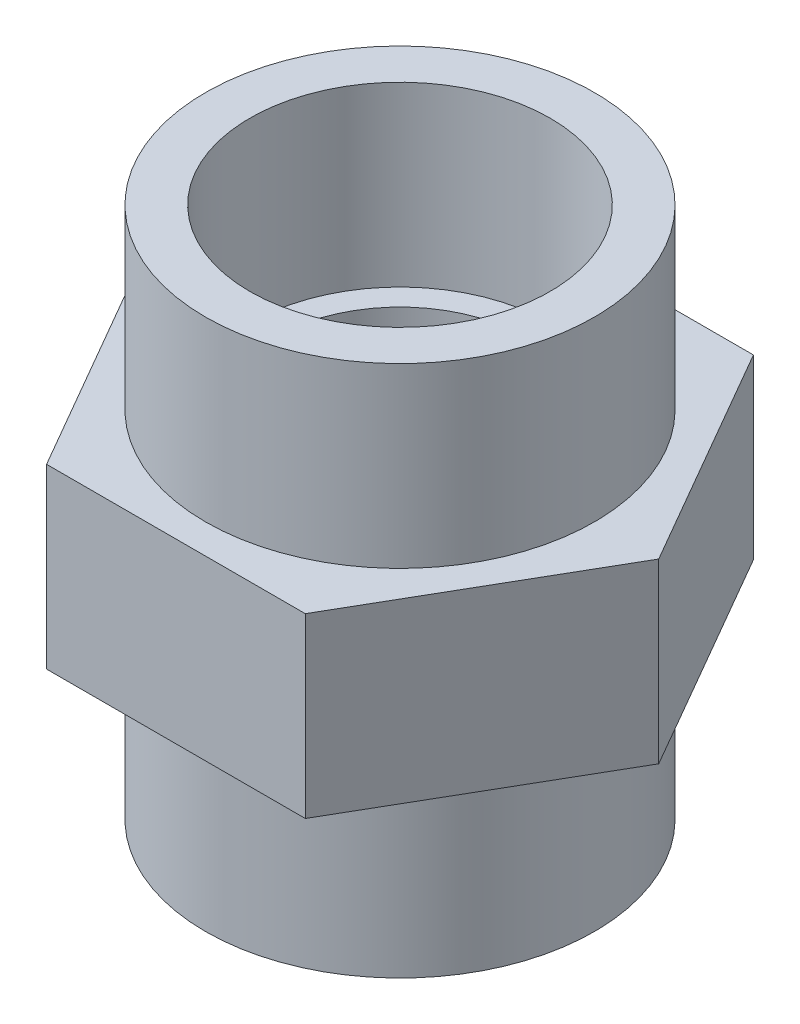
ISO-10303-21;
HEADER;
FILE_DESCRIPTION(('STEP AP214'),'2;1');
FILE_NAME('part.step','',(''),(''),'','','');
FILE_SCHEMA(('AUTOMOTIVE_DESIGN { 1 0 10303 214 1 1 1 1 }'));
ENDSEC;
DATA;
#1=APPLICATION_CONTEXT('core data for automotive mechanical design processes');
#2=APPLICATION_PROTOCOL_DEFINITION('international standard','automotive_design',2000,#1);
#3=PRODUCT_CONTEXT('',#1,'mechanical');
#4=PRODUCT('Part','Part','',(#3));
#5=PRODUCT_RELATED_PRODUCT_CATEGORY('part','',(#4));
#6=PRODUCT_DEFINITION_FORMATION('','',#4);
#7=PRODUCT_DEFINITION_CONTEXT('part definition',#1,'design');
#8=PRODUCT_DEFINITION('design','',#6,#7);
#9=PRODUCT_DEFINITION_SHAPE('','',#8);
#10=(LENGTH_UNIT() NAMED_UNIT(*) SI_UNIT(.MILLI.,.METRE.));
#11=(NAMED_UNIT(*) PLANE_ANGLE_UNIT() SI_UNIT($,.RADIAN.));
#12=(NAMED_UNIT(*) SI_UNIT($,.STERADIAN.) SOLID_ANGLE_UNIT());
#13=UNCERTAINTY_MEASURE_WITH_UNIT(LENGTH_MEASURE(1.E-05),#10,'distance_accuracy_value','');
#14=(GEOMETRIC_REPRESENTATION_CONTEXT(3) GLOBAL_UNCERTAINTY_ASSIGNED_CONTEXT((#13)) GLOBAL_UNIT_ASSIGNED_CONTEXT((#10,
#11,#12)) REPRESENTATION_CONTEXT('',''));
#15=CARTESIAN_POINT('',(0.,0.,0.));
#16=DIRECTION('',(0.,0.,1.));
#17=DIRECTION('',(1.,0.,0.));
#18=AXIS2_PLACEMENT_3D('',#15,#16,#17);
#19=CARTESIAN_POINT('',(0.,6.,0.));
#20=DIRECTION('',(0.,1.,0.));
#21=DIRECTION('',(0.,0.,1.));
#22=AXIS2_PLACEMENT_3D('',#19,#20,#21);
#23=PLANE('',#22);
#24=CARTESIAN_POINT('',(0.,6.,0.));
#25=DIRECTION('',(0.,1.,0.));
#26=DIRECTION('',(0.,0.,1.));
#27=AXIS2_PLACEMENT_3D('',#24,#25,#26);
#28=CIRCLE('',#27,4.25);
#29=CARTESIAN_POINT('',(0.,6.,4.25));
#30=VERTEX_POINT('',#29);
#31=EDGE_CURVE('E148',#30,#30,#28,.T.);
#32=ORIENTED_EDGE('',*,*,#31,.F.);
#33=EDGE_LOOP('',(#32));
#34=FACE_BOUND('',#33,.T.);
#35=CARTESIAN_POINT('',(0.,6.,0.));
#36=DIRECTION('',(0.,1.,0.));
#37=DIRECTION('',(0.,0.,1.));
#38=AXIS2_PLACEMENT_3D('',#35,#36,#37);
#39=CIRCLE('',#38,5.079);
#40=CARTESIAN_POINT('',(0.,6.,5.079));
#41=VERTEX_POINT('',#40);
#42=EDGE_CURVE('E12',#41,#41,#39,.F.);
#43=ORIENTED_EDGE('',*,*,#42,.F.);
#44=EDGE_LOOP('',(#43));
#45=FACE_BOUND('',#44,.T.);
#46=ADVANCED_FACE('F58',(#34,#45),#23,.T.);
#47=CARTESIAN_POINT('',(0.,-6.,0.));
#48=DIRECTION('',(0.,1.,0.));
#49=DIRECTION('',(0.,0.,1.));
#50=AXIS2_PLACEMENT_3D('',#47,#48,#49);
#51=CYLINDRICAL_SURFACE('',#50,4.25);
#52=CARTESIAN_POINT('',(0.,-6.,0.));
#53=DIRECTION('',(0.,1.,0.));
#54=DIRECTION('',(0.,0.,1.));
#55=AXIS2_PLACEMENT_3D('',#52,#53,#54);
#56=CIRCLE('',#55,4.25);
#57=CARTESIAN_POINT('',(0.,-6.,4.25));
#58=VERTEX_POINT('',#57);
#59=EDGE_CURVE('E165',#58,#58,#56,.T.);
#60=ORIENTED_EDGE('',*,*,#59,.F.);
#61=EDGE_LOOP('',(#60));
#62=FACE_BOUND('',#61,.T.);
#63=ORIENTED_EDGE('',*,*,#31,.T.);
#64=EDGE_LOOP('',(#63));
#65=FACE_BOUND('',#64,.T.);
#66=ADVANCED_FACE('F60',(#62,#65),#51,.F.);
#67=CARTESIAN_POINT('',(0.,-6.,0.));
#68=DIRECTION('',(0.,1.,0.));
#69=DIRECTION('',(0.,0.,1.));
#70=AXIS2_PLACEMENT_3D('',#67,#68,#69);
#71=CYLINDRICAL_SURFACE('',#70,6.579);
#72=CARTESIAN_POINT('',(0.,-6.,0.));
#73=DIRECTION('',(0.,1.,0.));
#74=DIRECTION('',(0.,0.,1.));
#75=AXIS2_PLACEMENT_3D('',#72,#73,#74);
#76=CIRCLE('',#75,6.579);
#77=CARTESIAN_POINT('',(0.,-6.,6.579));
#78=VERTEX_POINT('',#77);
#79=EDGE_CURVE('E67',#78,#78,#76,.T.);
#80=ORIENTED_EDGE('',*,*,#79,.T.);
#81=EDGE_LOOP('',(#80));
#82=FACE_BOUND('',#81,.T.);
#83=CARTESIAN_POINT('',(0.,0.,0.));
#84=DIRECTION('',(0.,1.,0.));
#85=DIRECTION('',(0.,0.,1.));
#86=AXIS2_PLACEMENT_3D('',#83,#84,#85);
#87=CIRCLE('',#86,6.579);
#88=CARTESIAN_POINT('',(0.,0.,6.579));
#89=VERTEX_POINT('',#88);
#90=EDGE_CURVE('E164',#89,#89,#87,.T.);
#91=ORIENTED_EDGE('',*,*,#90,.F.);
#92=EDGE_LOOP('',(#91));
#93=FACE_BOUND('',#92,.T.);
#94=ADVANCED_FACE('F175',(#82,#93),#71,.T.);
#95=CARTESIAN_POINT('',(0.,-6.,0.));
#96=DIRECTION('',(0.,1.,0.));
#97=DIRECTION('',(0.,0.,1.));
#98=AXIS2_PLACEMENT_3D('',#95,#96,#97);
#99=PLANE('',#98);
#100=ORIENTED_EDGE('',*,*,#59,.T.);
#101=EDGE_LOOP('',(#100));
#102=FACE_BOUND('',#101,.T.);
#103=ORIENTED_EDGE('',*,*,#79,.F.);
#104=EDGE_LOOP('',(#103));
#105=FACE_BOUND('',#104,.T.);
#106=ADVANCED_FACE('F177',(#102,#105),#99,.F.);
#107=CARTESIAN_POINT('',(0.,6.,0.));
#108=DIRECTION('',(0.,1.,0.));
#109=DIRECTION('',(0.,0.,1.));
#110=AXIS2_PLACEMENT_3D('',#107,#108,#109);
#111=CIRCLE('',#110,6.579);
#112=CARTESIAN_POINT('',(0.,6.,6.579));
#113=VERTEX_POINT('',#112);
#114=EDGE_CURVE('E203',#113,#113,#111,.T.);
#115=ORIENTED_EDGE('',*,*,#114,.F.);
#116=EDGE_LOOP('',(#115));
#117=FACE_BOUND('',#116,.T.);
#118=DIRECTION('',(0.5,0.,-0.866025403784439));
#119=VECTOR('',#118,1.);
#120=CARTESIAN_POINT('',(4.37573769018817,6.,7.579));
#121=LINE('',#120,#119);
#122=CARTESIAN_POINT('',(4.37573769018817,6.,7.579));
#123=VERTEX_POINT('',#122);
#124=CARTESIAN_POINT('',(8.75147538037634,6.,0.));
#125=VERTEX_POINT('',#124);
#126=EDGE_CURVE('E155',#123,#125,#121,.T.);
#127=ORIENTED_EDGE('',*,*,#126,.T.);
#128=DIRECTION('',(-0.5,0.,-0.866025403784438));
#129=VECTOR('',#128,1.);
#130=CARTESIAN_POINT('',(8.75147538037634,6.,0.));
#131=LINE('',#130,#129);
#132=CARTESIAN_POINT('',(4.37573769018817,6.,-7.579));
#133=VERTEX_POINT('',#132);
#134=EDGE_CURVE('E113',#125,#133,#131,.T.);
#135=ORIENTED_EDGE('',*,*,#134,.T.);
#136=DIRECTION('',(-1.,0.,0.));
#137=VECTOR('',#136,1.);
#138=CARTESIAN_POINT('',(4.37573769018817,6.,-7.579));
#139=LINE('',#138,#137);
#140=CARTESIAN_POINT('',(-4.37573769018818,6.,-7.579));
#141=VERTEX_POINT('',#140);
#142=EDGE_CURVE('E126',#133,#141,#139,.T.);
#143=ORIENTED_EDGE('',*,*,#142,.T.);
#144=DIRECTION('',(-0.5,0.,0.866025403784439));
#145=VECTOR('',#144,1.);
#146=CARTESIAN_POINT('',(-4.37573769018818,6.,-7.579));
#147=LINE('',#146,#145);
#148=CARTESIAN_POINT('',(-8.75147538037635,6.,0.));
#149=VERTEX_POINT('',#148);
#150=EDGE_CURVE('E120',#141,#149,#147,.T.);
#151=ORIENTED_EDGE('',*,*,#150,.T.);
#152=DIRECTION('',(0.5,0.,0.866025403784439));
#153=VECTOR('',#152,1.);
#154=CARTESIAN_POINT('',(-8.75147538037635,6.,0.));
#155=LINE('',#154,#153);
#156=CARTESIAN_POINT('',(-4.37573769018817,6.,7.579));
#157=VERTEX_POINT('',#156);
#158=EDGE_CURVE('E124',#149,#157,#155,.T.);
#159=ORIENTED_EDGE('',*,*,#158,.T.);
#160=DIRECTION('',(1.,0.,0.));
#161=VECTOR('',#160,1.);
#162=CARTESIAN_POINT('',(-4.37573769018817,6.,7.579));
#163=LINE('',#162,#161);
#164=EDGE_CURVE('E75',#157,#123,#163,.T.);
#165=ORIENTED_EDGE('',*,*,#164,.T.);
#166=EDGE_LOOP('',(#127,#135,#143,#151,#159,#165));
#167=FACE_BOUND('',#166,.T.);
#168=ADVANCED_FACE('F122',(#117,#167),#23,.T.);
#169=CARTESIAN_POINT('',(0.,0.,0.));
#170=DIRECTION('',(0.,1.,0.));
#171=DIRECTION('',(0.,0.,1.));
#172=AXIS2_PLACEMENT_3D('',#169,#170,#171);
#173=PLANE('',#172);
#174=ORIENTED_EDGE('',*,*,#90,.T.);
#175=EDGE_LOOP('',(#174));
#176=FACE_BOUND('',#175,.T.);
#177=DIRECTION('',(0.5,0.,-0.866025403784439));
#178=VECTOR('',#177,1.);
#179=CARTESIAN_POINT('',(4.37573769018817,0.,7.579));
#180=LINE('',#179,#178);
#181=CARTESIAN_POINT('',(4.37573769018817,0.,7.579));
#182=VERTEX_POINT('',#181);
#183=CARTESIAN_POINT('',(8.75147538037634,0.,0.));
#184=VERTEX_POINT('',#183);
#185=EDGE_CURVE('E144',#182,#184,#180,.T.);
#186=ORIENTED_EDGE('',*,*,#185,.F.);
#187=DIRECTION('',(1.,0.,0.));
#188=VECTOR('',#187,1.);
#189=CARTESIAN_POINT('',(-4.37573769018817,0.,7.579));
#190=LINE('',#189,#188);
#191=CARTESIAN_POINT('',(-4.37573769018817,0.,7.579));
#192=VERTEX_POINT('',#191);
#193=EDGE_CURVE('E104',#192,#182,#190,.T.);
#194=ORIENTED_EDGE('',*,*,#193,.F.);
#195=DIRECTION('',(0.5,0.,0.866025403784439));
#196=VECTOR('',#195,1.);
#197=CARTESIAN_POINT('',(-8.75147538037635,0.,0.));
#198=LINE('',#197,#196);
#199=CARTESIAN_POINT('',(-8.75147538037635,0.,0.));
#200=VERTEX_POINT('',#199);
#201=EDGE_CURVE('E98',#200,#192,#198,.T.);
#202=ORIENTED_EDGE('',*,*,#201,.F.);
#203=DIRECTION('',(-0.5,0.,0.866025403784439));
#204=VECTOR('',#203,1.);
#205=CARTESIAN_POINT('',(-4.37573769018818,0.,-7.579));
#206=LINE('',#205,#204);
#207=CARTESIAN_POINT('',(-4.37573769018818,0.,-7.579));
#208=VERTEX_POINT('',#207);
#209=EDGE_CURVE('E134',#208,#200,#206,.T.);
#210=ORIENTED_EDGE('',*,*,#209,.F.);
#211=DIRECTION('',(-1.,0.,0.));
#212=VECTOR('',#211,1.);
#213=CARTESIAN_POINT('',(4.37573769018817,0.,-7.579));
#214=LINE('',#213,#212);
#215=CARTESIAN_POINT('',(4.37573769018817,0.,-7.579));
#216=VERTEX_POINT('',#215);
#217=EDGE_CURVE('E150',#216,#208,#214,.T.);
#218=ORIENTED_EDGE('',*,*,#217,.F.);
#219=DIRECTION('',(-0.5,0.,-0.866025403784438));
#220=VECTOR('',#219,1.);
#221=CARTESIAN_POINT('',(8.75147538037634,0.,0.));
#222=LINE('',#221,#220);
#223=EDGE_CURVE('E147',#184,#216,#222,.T.);
#224=ORIENTED_EDGE('',*,*,#223,.F.);
#225=EDGE_LOOP('',(#186,#194,#202,#210,#218,#224));
#226=FACE_BOUND('',#225,.T.);
#227=ADVANCED_FACE('F172',(#176,#226),#173,.F.);
#228=CARTESIAN_POINT('',(4.37573769018817,6.,7.579));
#229=DIRECTION('',(-0.866025403784439,0.,-0.5));
#230=DIRECTION('',(-0.5,0.,0.866025403784439));
#231=AXIS2_PLACEMENT_3D('',#228,#229,#230);
#232=PLANE('',#231);
#233=ORIENTED_EDGE('',*,*,#185,.T.);
#234=DIRECTION('',(0.,-1.,0.));
#235=VECTOR('',#234,1.);
#236=CARTESIAN_POINT('',(8.75147538037634,6.,0.));
#237=LINE('',#236,#235);
#238=EDGE_CURVE('E162',#125,#184,#237,.T.);
#239=ORIENTED_EDGE('',*,*,#238,.F.);
#240=ORIENTED_EDGE('',*,*,#126,.F.);
#241=DIRECTION('',(0.,-1.,0.));
#242=VECTOR('',#241,1.);
#243=CARTESIAN_POINT('',(4.37573769018817,6.,7.579));
#244=LINE('',#243,#242);
#245=EDGE_CURVE('E140',#123,#182,#244,.T.);
#246=ORIENTED_EDGE('',*,*,#245,.T.);
#247=EDGE_LOOP('',(#233,#239,#240,#246));
#248=FACE_BOUND('',#247,.T.);
#249=ADVANCED_FACE('F200',(#248),#232,.F.);
#250=CARTESIAN_POINT('',(8.75147538037634,6.,0.));
#251=DIRECTION('',(-0.866025403784439,0.,0.5));
#252=DIRECTION('',(0.5,0.,0.866025403784439));
#253=AXIS2_PLACEMENT_3D('',#250,#251,#252);
#254=PLANE('',#253);
#255=ORIENTED_EDGE('',*,*,#223,.T.);
#256=DIRECTION('',(0.,-1.,0.));
#257=VECTOR('',#256,1.);
#258=CARTESIAN_POINT('',(4.37573769018817,6.,-7.579));
#259=LINE('',#258,#257);
#260=EDGE_CURVE('E159',#133,#216,#259,.T.);
#261=ORIENTED_EDGE('',*,*,#260,.F.);
#262=ORIENTED_EDGE('',*,*,#134,.F.);
#263=ORIENTED_EDGE('',*,*,#238,.T.);
#264=EDGE_LOOP('',(#255,#261,#262,#263));
#265=FACE_BOUND('',#264,.T.);
#266=ADVANCED_FACE('F218',(#265),#254,.F.);
#267=CARTESIAN_POINT('',(4.37573769018817,6.,-7.579));
#268=DIRECTION('',(0.,0.,1.));
#269=DIRECTION('',(1.,0.,0.));
#270=AXIS2_PLACEMENT_3D('',#267,#268,#269);
#271=PLANE('',#270);
#272=ORIENTED_EDGE('',*,*,#217,.T.);
#273=DIRECTION('',(0.,-1.,0.));
#274=VECTOR('',#273,1.);
#275=CARTESIAN_POINT('',(-4.37573769018818,6.,-7.579));
#276=LINE('',#275,#274);
#277=EDGE_CURVE('E135',#141,#208,#276,.T.);
#278=ORIENTED_EDGE('',*,*,#277,.F.);
#279=ORIENTED_EDGE('',*,*,#142,.F.);
#280=ORIENTED_EDGE('',*,*,#260,.T.);
#281=EDGE_LOOP('',(#272,#278,#279,#280));
#282=FACE_BOUND('',#281,.T.);
#283=ADVANCED_FACE('F221',(#282),#271,.F.);
#284=CARTESIAN_POINT('',(-4.37573769018818,6.,-7.579));
#285=DIRECTION('',(0.866025403784439,0.,0.5));
#286=DIRECTION('',(0.5,0.,-0.866025403784439));
#287=AXIS2_PLACEMENT_3D('',#284,#285,#286);
#288=PLANE('',#287);
#289=ORIENTED_EDGE('',*,*,#209,.T.);
#290=DIRECTION('',(0.,-1.,0.));
#291=VECTOR('',#290,1.);
#292=CARTESIAN_POINT('',(-8.75147538037635,6.,0.));
#293=LINE('',#292,#291);
#294=EDGE_CURVE('E131',#149,#200,#293,.T.);
#295=ORIENTED_EDGE('',*,*,#294,.F.);
#296=ORIENTED_EDGE('',*,*,#150,.F.);
#297=ORIENTED_EDGE('',*,*,#277,.T.);
#298=EDGE_LOOP('',(#289,#295,#296,#297));
#299=FACE_BOUND('',#298,.T.);
#300=ADVANCED_FACE('F132',(#299),#288,.F.);
#301=CARTESIAN_POINT('',(-8.75147538037635,6.,0.));
#302=DIRECTION('',(0.866025403784438,0.,-0.5));
#303=DIRECTION('',(-0.5,0.,-0.866025403784439));
#304=AXIS2_PLACEMENT_3D('',#301,#302,#303);
#305=PLANE('',#304);
#306=ORIENTED_EDGE('',*,*,#201,.T.);
#307=DIRECTION('',(0.,-1.,0.));
#308=VECTOR('',#307,1.);
#309=CARTESIAN_POINT('',(-4.37573769018817,6.,7.579));
#310=LINE('',#309,#308);
#311=EDGE_CURVE('E136',#157,#192,#310,.T.);
#312=ORIENTED_EDGE('',*,*,#311,.F.);
#313=ORIENTED_EDGE('',*,*,#158,.F.);
#314=ORIENTED_EDGE('',*,*,#294,.T.);
#315=EDGE_LOOP('',(#306,#312,#313,#314));
#316=FACE_BOUND('',#315,.T.);
#317=ADVANCED_FACE('F138',(#316),#305,.F.);
#318=CARTESIAN_POINT('',(-4.37573769018817,6.,7.579));
#319=DIRECTION('',(0.,0.,-1.));
#320=DIRECTION('',(-1.,0.,0.));
#321=AXIS2_PLACEMENT_3D('',#318,#319,#320);
#322=PLANE('',#321);
#323=ORIENTED_EDGE('',*,*,#193,.T.);
#324=ORIENTED_EDGE('',*,*,#245,.F.);
#325=ORIENTED_EDGE('',*,*,#164,.F.);
#326=ORIENTED_EDGE('',*,*,#311,.T.);
#327=EDGE_LOOP('',(#323,#324,#325,#326));
#328=FACE_BOUND('',#327,.T.);
#329=ADVANCED_FACE('F224',(#328),#322,.F.);
#330=CARTESIAN_POINT('',(0.,12.,0.));
#331=DIRECTION('',(0.,1.,0.));
#332=DIRECTION('',(0.,0.,1.));
#333=AXIS2_PLACEMENT_3D('',#330,#331,#332);
#334=PLANE('',#333);
#335=CARTESIAN_POINT('',(0.,12.,0.));
#336=DIRECTION('',(0.,1.,0.));
#337=DIRECTION('',(0.,0.,1.));
#338=AXIS2_PLACEMENT_3D('',#335,#336,#337);
#339=CIRCLE('',#338,6.579);
#340=CARTESIAN_POINT('',(0.,12.,6.579));
#341=VERTEX_POINT('',#340);
#342=EDGE_CURVE('E205',#341,#341,#339,.T.);
#343=ORIENTED_EDGE('',*,*,#342,.T.);
#344=EDGE_LOOP('',(#343));
#345=FACE_BOUND('',#344,.T.);
#346=CARTESIAN_POINT('',(0.,12.,0.));
#347=DIRECTION('',(0.,1.,0.));
#348=DIRECTION('',(0.,0.,1.));
#349=AXIS2_PLACEMENT_3D('',#346,#347,#348);
#350=CIRCLE('',#349,5.079);
#351=CARTESIAN_POINT('',(0.,12.,5.079));
#352=VERTEX_POINT('',#351);
#353=EDGE_CURVE('E206',#352,#352,#350,.T.);
#354=ORIENTED_EDGE('',*,*,#353,.F.);
#355=EDGE_LOOP('',(#354));
#356=FACE_BOUND('',#355,.T.);
#357=ADVANCED_FACE('F226',(#345,#356),#334,.T.);
#358=CARTESIAN_POINT('',(0.,12.,0.));
#359=DIRECTION('',(0.,-1.,0.));
#360=DIRECTION('',(0.,0.,-1.));
#361=AXIS2_PLACEMENT_3D('',#358,#359,#360);
#362=CYLINDRICAL_SURFACE('',#361,6.579);
#363=ORIENTED_EDGE('',*,*,#342,.F.);
#364=EDGE_LOOP('',(#363));
#365=FACE_BOUND('',#364,.T.);
#366=ORIENTED_EDGE('',*,*,#114,.T.);
#367=EDGE_LOOP('',(#366));
#368=FACE_BOUND('',#367,.T.);
#369=ADVANCED_FACE('F232',(#365,#368),#362,.T.);
#370=CARTESIAN_POINT('',(0.,12.,0.));
#371=DIRECTION('',(0.,-1.,0.));
#372=DIRECTION('',(0.,0.,-1.));
#373=AXIS2_PLACEMENT_3D('',#370,#371,#372);
#374=CYLINDRICAL_SURFACE('',#373,5.079);
#375=ORIENTED_EDGE('',*,*,#353,.T.);
#376=EDGE_LOOP('',(#375));
#377=FACE_BOUND('',#376,.T.);
#378=ORIENTED_EDGE('',*,*,#42,.T.);
#379=EDGE_LOOP('',(#378));
#380=FACE_BOUND('',#379,.T.);
#381=ADVANCED_FACE('F293',(#377,#380),#374,.F.);
#382=CLOSED_SHELL('',(#46,#66,#94,#106,#168,#227,#249,#266,#283,#300,#317,#329,#357,#369,#381));
#383=MANIFOLD_SOLID_BREP('B2',#382);
#384=ADVANCED_BREP_SHAPE_REPRESENTATION('',(#18,#383),#14);
#385=SHAPE_DEFINITION_REPRESENTATION(#9,#384);
ENDSEC;
END-ISO-10303-21;
